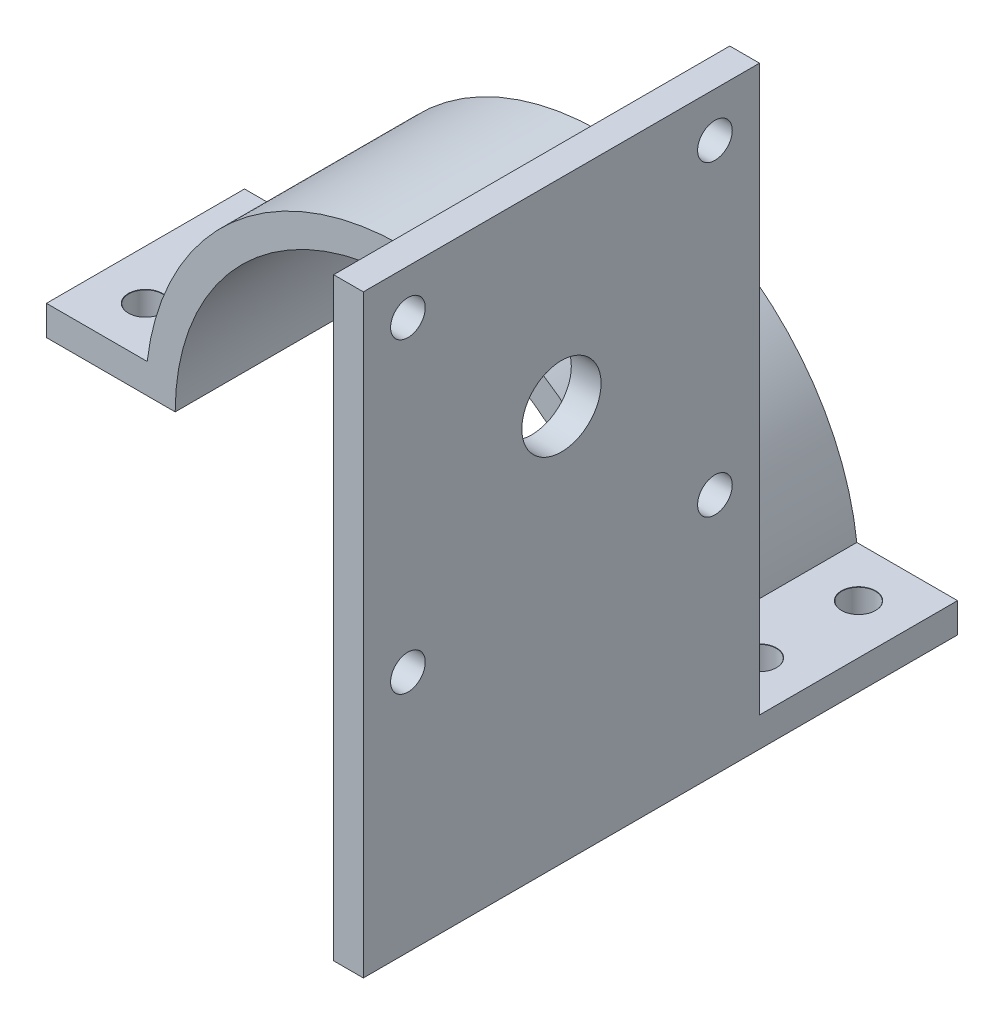
ISO-10303-21;
HEADER;
FILE_DESCRIPTION(('STEP AP214'),'2;1');
FILE_NAME('part.step','',(''),(''),'','','');
FILE_SCHEMA(('AUTOMOTIVE_DESIGN { 1 0 10303 214 1 1 1 1 }'));
ENDSEC;
DATA;
#1=APPLICATION_CONTEXT('core data for automotive mechanical design processes');
#2=APPLICATION_PROTOCOL_DEFINITION('international standard','automotive_design',2000,#1);
#3=PRODUCT_CONTEXT('',#1,'mechanical');
#4=PRODUCT('Part','Part','',(#3));
#5=PRODUCT_RELATED_PRODUCT_CATEGORY('part','',(#4));
#6=PRODUCT_DEFINITION_FORMATION('','',#4);
#7=PRODUCT_DEFINITION_CONTEXT('part definition',#1,'design');
#8=PRODUCT_DEFINITION('design','',#6,#7);
#9=PRODUCT_DEFINITION_SHAPE('','',#8);
#10=(LENGTH_UNIT() NAMED_UNIT(*) SI_UNIT(.MILLI.,.METRE.));
#11=(NAMED_UNIT(*) PLANE_ANGLE_UNIT() SI_UNIT($,.RADIAN.));
#12=(NAMED_UNIT(*) SI_UNIT($,.STERADIAN.) SOLID_ANGLE_UNIT());
#13=UNCERTAINTY_MEASURE_WITH_UNIT(LENGTH_MEASURE(1.E-05),#10,'distance_accuracy_value','');
#14=(GEOMETRIC_REPRESENTATION_CONTEXT(3) GLOBAL_UNCERTAINTY_ASSIGNED_CONTEXT((#13)) GLOBAL_UNIT_ASSIGNED_CONTEXT((#10,
#11,#12)) REPRESENTATION_CONTEXT('',''));
#15=CARTESIAN_POINT('',(0.,0.,0.));
#16=DIRECTION('',(0.,0.,1.));
#17=DIRECTION('',(1.,0.,0.));
#18=AXIS2_PLACEMENT_3D('',#15,#16,#17);
#19=CARTESIAN_POINT('',(0.,0.,20.));
#20=DIRECTION('',(0.,0.,-1.));
#21=DIRECTION('',(-1.,0.,0.));
#22=AXIS2_PLACEMENT_3D('',#19,#20,#21);
#23=PLANE('',#22);
#24=DIRECTION('',(0.,-1.,0.));
#25=VECTOR('',#24,1.);
#26=CARTESIAN_POINT('',(33.,60.,20.));
#27=LINE('',#26,#25);
#28=CARTESIAN_POINT('',(33.,2.99999999999999,20.));
#29=VERTEX_POINT('',#28);
#30=CARTESIAN_POINT('',(33.,0.,20.));
#31=VERTEX_POINT('',#30);
#32=EDGE_CURVE('E11',#29,#31,#27,.T.);
#33=ORIENTED_EDGE('',*,*,#32,.F.);
#34=DIRECTION('',(-1.,0.,0.));
#35=VECTOR('',#34,1.);
#36=CARTESIAN_POINT('',(23.,3.,20.));
#37=LINE('',#36,#35);
#38=CARTESIAN_POINT('',(25.8263431402899,3.,20.));
#39=VERTEX_POINT('',#38);
#40=EDGE_CURVE('E203',#29,#39,#37,.T.);
#41=ORIENTED_EDGE('',*,*,#40,.T.);
#42=CARTESIAN_POINT('',(0.,0.,20.));
#43=DIRECTION('',(0.,0.,1.));
#44=DIRECTION('',(-1.,0.,0.));
#45=AXIS2_PLACEMENT_3D('',#42,#43,#44);
#46=CIRCLE('',#45,26.);
#47=CARTESIAN_POINT('',(-25.8263431402899,3.,20.));
#48=VERTEX_POINT('',#47);
#49=EDGE_CURVE('E241',#39,#48,#46,.T.);
#50=ORIENTED_EDGE('',*,*,#49,.T.);
#51=DIRECTION('',(-1.,0.,0.));
#52=VECTOR('',#51,1.);
#53=CARTESIAN_POINT('',(-23.,3.,20.));
#54=LINE('',#53,#52);
#55=CARTESIAN_POINT('',(-36.,3.,20.));
#56=VERTEX_POINT('',#55);
#57=EDGE_CURVE('E215',#48,#56,#54,.T.);
#58=ORIENTED_EDGE('',*,*,#57,.T.);
#59=DIRECTION('',(0.,-1.,0.));
#60=VECTOR('',#59,1.);
#61=CARTESIAN_POINT('',(-36.,3.,20.));
#62=LINE('',#61,#60);
#63=CARTESIAN_POINT('',(-36.,0.,20.));
#64=VERTEX_POINT('',#63);
#65=EDGE_CURVE('E216',#56,#64,#62,.T.);
#66=ORIENTED_EDGE('',*,*,#65,.T.);
#67=DIRECTION('',(1.,0.,0.));
#68=VECTOR('',#67,1.);
#69=CARTESIAN_POINT('',(-23.,0.,20.));
#70=LINE('',#69,#68);
#71=CARTESIAN_POINT('',(-23.,0.,20.));
#72=VERTEX_POINT('',#71);
#73=EDGE_CURVE('E243',#64,#72,#70,.T.);
#74=ORIENTED_EDGE('',*,*,#73,.T.);
#75=CARTESIAN_POINT('',(0.,0.,20.));
#76=DIRECTION('',(0.,0.,-1.));
#77=DIRECTION('',(-1.,0.,0.));
#78=AXIS2_PLACEMENT_3D('',#75,#76,#77);
#79=CIRCLE('',#78,23.);
#80=CARTESIAN_POINT('',(23.,0.,20.));
#81=VERTEX_POINT('',#80);
#82=EDGE_CURVE('E235',#72,#81,#79,.T.);
#83=ORIENTED_EDGE('',*,*,#82,.T.);
#84=DIRECTION('',(1.,0.,0.));
#85=VECTOR('',#84,1.);
#86=CARTESIAN_POINT('',(23.,0.,20.));
#87=LINE('',#86,#85);
#88=EDGE_CURVE('E238',#81,#31,#87,.T.);
#89=ORIENTED_EDGE('',*,*,#88,.T.);
#90=EDGE_LOOP('',(#33,#41,#50,#58,#66,#74,#83,#89));
#91=FACE_BOUND('',#90,.T.);
#92=ADVANCED_FACE('F37',(#91),#23,.F.);
#93=CARTESIAN_POINT('',(0.,0.,20.));
#94=DIRECTION('',(0.,0.,-1.));
#95=DIRECTION('',(-1.,0.,0.));
#96=AXIS2_PLACEMENT_3D('',#93,#94,#95);
#97=CYLINDRICAL_SURFACE('',#96,23.);
#98=CARTESIAN_POINT('',(0.,0.,0.));
#99=DIRECTION('',(0.,0.,-1.));
#100=DIRECTION('',(-1.,0.,0.));
#101=AXIS2_PLACEMENT_3D('',#98,#99,#100);
#102=CIRCLE('',#101,23.);
#103=CARTESIAN_POINT('',(-23.,0.,0.));
#104=VERTEX_POINT('',#103);
#105=CARTESIAN_POINT('',(23.,0.,0.));
#106=VERTEX_POINT('',#105);
#107=EDGE_CURVE('E234',#104,#106,#102,.T.);
#108=ORIENTED_EDGE('',*,*,#107,.T.);
#109=DIRECTION('',(0.,0.,-1.));
#110=VECTOR('',#109,1.);
#111=CARTESIAN_POINT('',(23.,0.,20.));
#112=LINE('',#111,#110);
#113=EDGE_CURVE('E41',#81,#106,#112,.T.);
#114=ORIENTED_EDGE('',*,*,#113,.F.);
#115=ORIENTED_EDGE('',*,*,#82,.F.);
#116=DIRECTION('',(0.,0.,-1.));
#117=VECTOR('',#116,1.);
#118=CARTESIAN_POINT('',(-23.,0.,20.));
#119=LINE('',#118,#117);
#120=EDGE_CURVE('E245',#72,#104,#119,.T.);
#121=ORIENTED_EDGE('',*,*,#120,.T.);
#122=EDGE_LOOP('',(#108,#114,#115,#121));
#123=FACE_BOUND('',#122,.T.);
#124=ADVANCED_FACE('F39',(#123),#97,.F.);
#125=CARTESIAN_POINT('',(23.,0.,20.));
#126=DIRECTION('',(0.,1.,0.));
#127=DIRECTION('',(-1.,0.,0.));
#128=AXIS2_PLACEMENT_3D('',#125,#126,#127);
#129=PLANE('',#128);
#130=CARTESIAN_POINT('',(31.,0.,5.));
#131=DIRECTION('',(0.,1.,0.));
#132=DIRECTION('',(0.,0.,1.));
#133=AXIS2_PLACEMENT_3D('',#130,#131,#132);
#134=CIRCLE('',#133,1.7);
#135=CARTESIAN_POINT('',(31.,0.,6.7));
#136=VERTEX_POINT('',#135);
#137=EDGE_CURVE('E189',#136,#136,#134,.T.);
#138=ORIENTED_EDGE('',*,*,#137,.T.);
#139=EDGE_LOOP('',(#138));
#140=FACE_BOUND('',#139,.T.);
#141=CARTESIAN_POINT('',(31.,0.,15.));
#142=DIRECTION('',(0.,1.,0.));
#143=DIRECTION('',(0.,0.,1.));
#144=AXIS2_PLACEMENT_3D('',#141,#142,#143);
#145=CIRCLE('',#144,1.7);
#146=CARTESIAN_POINT('',(31.,0.,16.7));
#147=VERTEX_POINT('',#146);
#148=EDGE_CURVE('E198',#147,#147,#145,.T.);
#149=ORIENTED_EDGE('',*,*,#148,.T.);
#150=EDGE_LOOP('',(#149));
#151=FACE_BOUND('',#150,.T.);
#152=DIRECTION('',(1.,0.,0.));
#153=VECTOR('',#152,1.);
#154=CARTESIAN_POINT('',(23.,0.,0.));
#155=LINE('',#154,#153);
#156=CARTESIAN_POINT('',(36.,0.,0.));
#157=VERTEX_POINT('',#156);
#158=EDGE_CURVE('E248',#106,#157,#155,.T.);
#159=ORIENTED_EDGE('',*,*,#158,.T.);
#160=DIRECTION('',(0.,0.,1.));
#161=VECTOR('',#160,1.);
#162=CARTESIAN_POINT('',(36.,0.,-13.3416640641263));
#163=LINE('',#162,#161);
#164=CARTESIAN_POINT('',(36.,0.,60.));
#165=VERTEX_POINT('',#164);
#166=EDGE_CURVE('E201',#157,#165,#163,.T.);
#167=ORIENTED_EDGE('',*,*,#166,.T.);
#168=DIRECTION('',(-1.,0.,0.));
#169=VECTOR('',#168,1.);
#170=CARTESIAN_POINT('',(36.,0.,60.));
#171=LINE('',#170,#169);
#172=CARTESIAN_POINT('',(33.,0.,60.));
#173=VERTEX_POINT('',#172);
#174=EDGE_CURVE('E130',#165,#173,#171,.T.);
#175=ORIENTED_EDGE('',*,*,#174,.T.);
#176=DIRECTION('',(0.,0.,-1.));
#177=VECTOR('',#176,1.);
#178=CARTESIAN_POINT('',(33.,0.,20.));
#179=LINE('',#178,#177);
#180=EDGE_CURVE('E150',#173,#31,#179,.T.);
#181=ORIENTED_EDGE('',*,*,#180,.T.);
#182=ORIENTED_EDGE('',*,*,#88,.F.);
#183=ORIENTED_EDGE('',*,*,#113,.T.);
#184=EDGE_LOOP('',(#159,#167,#175,#181,#182,#183));
#185=FACE_BOUND('',#184,.T.);
#186=ADVANCED_FACE('F260',(#140,#151,#185),#129,.F.);
#187=CARTESIAN_POINT('',(0.,0.,20.));
#188=DIRECTION('',(0.,0.,-1.));
#189=DIRECTION('',(-1.,0.,0.));
#190=AXIS2_PLACEMENT_3D('',#187,#188,#189);
#191=CYLINDRICAL_SURFACE('',#190,26.);
#192=ORIENTED_EDGE('',*,*,#49,.F.);
#193=DIRECTION('',(0.,0.,-1.));
#194=VECTOR('',#193,1.);
#195=CARTESIAN_POINT('',(25.8263431402899,3.,20.));
#196=LINE('',#195,#194);
#197=CARTESIAN_POINT('',(25.8263431402899,3.,0.));
#198=VERTEX_POINT('',#197);
#199=EDGE_CURVE('E213',#39,#198,#196,.T.);
#200=ORIENTED_EDGE('',*,*,#199,.T.);
#201=CARTESIAN_POINT('',(0.,0.,0.));
#202=DIRECTION('',(0.,0.,1.));
#203=DIRECTION('',(-1.,0.,0.));
#204=AXIS2_PLACEMENT_3D('',#201,#202,#203);
#205=CIRCLE('',#204,26.);
#206=CARTESIAN_POINT('',(-25.8263431402899,3.,0.));
#207=VERTEX_POINT('',#206);
#208=EDGE_CURVE('E250',#198,#207,#205,.T.);
#209=ORIENTED_EDGE('',*,*,#208,.T.);
#210=DIRECTION('',(0.,0.,-1.));
#211=VECTOR('',#210,1.);
#212=CARTESIAN_POINT('',(-25.8263431402899,3.,20.));
#213=LINE('',#212,#211);
#214=EDGE_CURVE('E229',#207,#48,#213,.F.);
#215=ORIENTED_EDGE('',*,*,#214,.T.);
#216=EDGE_LOOP('',(#192,#200,#209,#215));
#217=FACE_BOUND('',#216,.T.);
#218=ADVANCED_FACE('F283',(#217),#191,.T.);
#219=CARTESIAN_POINT('',(-23.,0.,20.));
#220=DIRECTION('',(0.,1.,0.));
#221=DIRECTION('',(-1.,0.,0.));
#222=AXIS2_PLACEMENT_3D('',#219,#220,#221);
#223=PLANE('',#222);
#224=CARTESIAN_POINT('',(-31.,0.,5.));
#225=DIRECTION('',(0.,1.,0.));
#226=DIRECTION('',(0.,0.,1.));
#227=AXIS2_PLACEMENT_3D('',#224,#225,#226);
#228=CIRCLE('',#227,1.7);
#229=CARTESIAN_POINT('',(-31.,0.,6.7));
#230=VERTEX_POINT('',#229);
#231=EDGE_CURVE('E171',#230,#230,#228,.T.);
#232=ORIENTED_EDGE('',*,*,#231,.T.);
#233=EDGE_LOOP('',(#232));
#234=FACE_BOUND('',#233,.T.);
#235=CARTESIAN_POINT('',(-31.,0.,15.));
#236=DIRECTION('',(0.,1.,0.));
#237=DIRECTION('',(0.,0.,1.));
#238=AXIS2_PLACEMENT_3D('',#235,#236,#237);
#239=CIRCLE('',#238,1.7);
#240=CARTESIAN_POINT('',(-31.,0.,16.7));
#241=VERTEX_POINT('',#240);
#242=EDGE_CURVE('E180',#241,#241,#239,.T.);
#243=ORIENTED_EDGE('',*,*,#242,.T.);
#244=EDGE_LOOP('',(#243));
#245=FACE_BOUND('',#244,.T.);
#246=DIRECTION('',(1.,0.,0.));
#247=VECTOR('',#246,1.);
#248=CARTESIAN_POINT('',(-23.,0.,0.));
#249=LINE('',#248,#247);
#250=CARTESIAN_POINT('',(-36.,0.,0.));
#251=VERTEX_POINT('',#250);
#252=EDGE_CURVE('E239',#251,#104,#249,.T.);
#253=ORIENTED_EDGE('',*,*,#252,.T.);
#254=ORIENTED_EDGE('',*,*,#120,.F.);
#255=ORIENTED_EDGE('',*,*,#73,.F.);
#256=DIRECTION('',(0.,0.,1.));
#257=VECTOR('',#256,1.);
#258=CARTESIAN_POINT('',(-36.,0.,-13.3416640641263));
#259=LINE('',#258,#257);
#260=EDGE_CURVE('E224',#251,#64,#259,.T.);
#261=ORIENTED_EDGE('',*,*,#260,.F.);
#262=EDGE_LOOP('',(#253,#254,#255,#261));
#263=FACE_BOUND('',#262,.T.);
#264=ADVANCED_FACE('F287',(#234,#245,#263),#223,.F.);
#265=CARTESIAN_POINT('',(0.,0.,0.));
#266=DIRECTION('',(0.,0.,-1.));
#267=DIRECTION('',(-1.,0.,0.));
#268=AXIS2_PLACEMENT_3D('',#265,#266,#267);
#269=PLANE('',#268);
#270=ORIENTED_EDGE('',*,*,#158,.F.);
#271=ORIENTED_EDGE('',*,*,#107,.F.);
#272=ORIENTED_EDGE('',*,*,#252,.F.);
#273=DIRECTION('',(0.,-1.,0.));
#274=VECTOR('',#273,1.);
#275=CARTESIAN_POINT('',(-36.,3.,0.));
#276=LINE('',#275,#274);
#277=CARTESIAN_POINT('',(-36.,3.,0.));
#278=VERTEX_POINT('',#277);
#279=EDGE_CURVE('E221',#278,#251,#276,.T.);
#280=ORIENTED_EDGE('',*,*,#279,.F.);
#281=DIRECTION('',(-1.,0.,0.));
#282=VECTOR('',#281,1.);
#283=CARTESIAN_POINT('',(-23.,3.,0.));
#284=LINE('',#283,#282);
#285=EDGE_CURVE('E219',#207,#278,#284,.T.);
#286=ORIENTED_EDGE('',*,*,#285,.F.);
#287=ORIENTED_EDGE('',*,*,#208,.F.);
#288=DIRECTION('',(-1.,0.,0.));
#289=VECTOR('',#288,1.);
#290=CARTESIAN_POINT('',(23.,3.,0.));
#291=LINE('',#290,#289);
#292=CARTESIAN_POINT('',(36.,2.99999999999999,0.));
#293=VERTEX_POINT('',#292);
#294=EDGE_CURVE('E60',#293,#198,#291,.T.);
#295=ORIENTED_EDGE('',*,*,#294,.F.);
#296=DIRECTION('',(0.,1.,0.));
#297=VECTOR('',#296,1.);
#298=CARTESIAN_POINT('',(36.,2.99999999999999,0.));
#299=LINE('',#298,#297);
#300=EDGE_CURVE('E204',#157,#293,#299,.T.);
#301=ORIENTED_EDGE('',*,*,#300,.F.);
#302=EDGE_LOOP('',(#270,#271,#272,#280,#286,#287,#295,#301));
#303=FACE_BOUND('',#302,.T.);
#304=ADVANCED_FACE('F263',(#303),#269,.T.);
#305=CARTESIAN_POINT('',(-23.,3.,-13.3416640641263));
#306=DIRECTION('',(0.,1.,0.));
#307=DIRECTION('',(-1.,0.,0.));
#308=AXIS2_PLACEMENT_3D('',#305,#306,#307);
#309=PLANE('',#308);
#310=CARTESIAN_POINT('',(-31.,3.,5.));
#311=DIRECTION('',(0.,1.,0.));
#312=DIRECTION('',(0.,0.,1.));
#313=AXIS2_PLACEMENT_3D('',#310,#311,#312);
#314=CIRCLE('',#313,1.725);
#315=CARTESIAN_POINT('',(-31.,3.,6.725));
#316=VERTEX_POINT('',#315);
#317=EDGE_CURVE('E162',#316,#316,#314,.T.);
#318=ORIENTED_EDGE('',*,*,#317,.F.);
#319=EDGE_LOOP('',(#318));
#320=FACE_BOUND('',#319,.T.);
#321=CARTESIAN_POINT('',(-31.,3.,15.));
#322=DIRECTION('',(0.,1.,0.));
#323=DIRECTION('',(0.,0.,1.));
#324=AXIS2_PLACEMENT_3D('',#321,#322,#323);
#325=CIRCLE('',#324,1.725);
#326=CARTESIAN_POINT('',(-31.,3.,16.725));
#327=VERTEX_POINT('',#326);
#328=EDGE_CURVE('E174',#327,#327,#325,.T.);
#329=ORIENTED_EDGE('',*,*,#328,.F.);
#330=EDGE_LOOP('',(#329));
#331=FACE_BOUND('',#330,.T.);
#332=ORIENTED_EDGE('',*,*,#214,.F.);
#333=ORIENTED_EDGE('',*,*,#285,.T.);
#334=DIRECTION('',(0.,0.,1.));
#335=VECTOR('',#334,1.);
#336=CARTESIAN_POINT('',(-36.,3.,-13.3416640641263));
#337=LINE('',#336,#335);
#338=EDGE_CURVE('E225',#278,#56,#337,.T.);
#339=ORIENTED_EDGE('',*,*,#338,.T.);
#340=ORIENTED_EDGE('',*,*,#57,.F.);
#341=EDGE_LOOP('',(#332,#333,#339,#340));
#342=FACE_BOUND('',#341,.T.);
#343=ADVANCED_FACE('F279',(#320,#331,#342),#309,.T.);
#344=CARTESIAN_POINT('',(-36.,3.,-13.3416640641263));
#345=DIRECTION('',(-1.,0.,0.));
#346=DIRECTION('',(0.,0.,1.));
#347=AXIS2_PLACEMENT_3D('',#344,#345,#346);
#348=PLANE('',#347);
#349=ORIENTED_EDGE('',*,*,#338,.F.);
#350=ORIENTED_EDGE('',*,*,#279,.T.);
#351=ORIENTED_EDGE('',*,*,#260,.T.);
#352=ORIENTED_EDGE('',*,*,#65,.F.);
#353=EDGE_LOOP('',(#349,#350,#351,#352));
#354=FACE_BOUND('',#353,.T.);
#355=ADVANCED_FACE('F285',(#354),#348,.T.);
#356=CARTESIAN_POINT('',(23.,3.,-13.3416640641263));
#357=DIRECTION('',(0.,1.,0.));
#358=DIRECTION('',(-1.,0.,0.));
#359=AXIS2_PLACEMENT_3D('',#356,#357,#358);
#360=PLANE('',#359);
#361=CARTESIAN_POINT('',(31.,3.00000000000001,5.));
#362=DIRECTION('',(0.,1.,0.));
#363=DIRECTION('',(0.,0.,1.));
#364=AXIS2_PLACEMENT_3D('',#361,#362,#363);
#365=CIRCLE('',#364,1.725);
#366=CARTESIAN_POINT('',(31.,3.00000000000001,6.725));
#367=VERTEX_POINT('',#366);
#368=EDGE_CURVE('E183',#367,#367,#365,.T.);
#369=ORIENTED_EDGE('',*,*,#368,.F.);
#370=EDGE_LOOP('',(#369));
#371=FACE_BOUND('',#370,.T.);
#372=CARTESIAN_POINT('',(31.,3.00000000000001,15.));
#373=DIRECTION('',(0.,1.,0.));
#374=DIRECTION('',(0.,0.,1.));
#375=AXIS2_PLACEMENT_3D('',#372,#373,#374);
#376=CIRCLE('',#375,1.725);
#377=CARTESIAN_POINT('',(31.,3.00000000000001,16.725));
#378=VERTEX_POINT('',#377);
#379=EDGE_CURVE('E192',#378,#378,#376,.T.);
#380=ORIENTED_EDGE('',*,*,#379,.F.);
#381=EDGE_LOOP('',(#380));
#382=FACE_BOUND('',#381,.T.);
#383=ORIENTED_EDGE('',*,*,#199,.F.);
#384=ORIENTED_EDGE('',*,*,#40,.F.);
#385=CARTESIAN_POINT('',(36.,2.99999999999999,20.));
#386=VERTEX_POINT('',#385);
#387=EDGE_CURVE('E210',#386,#29,#37,.T.);
#388=ORIENTED_EDGE('',*,*,#387,.F.);
#389=DIRECTION('',(0.,0.,1.));
#390=VECTOR('',#389,1.);
#391=CARTESIAN_POINT('',(36.,2.99999999999999,-13.3416640641263));
#392=LINE('',#391,#390);
#393=EDGE_CURVE('E205',#293,#386,#392,.T.);
#394=ORIENTED_EDGE('',*,*,#393,.F.);
#395=ORIENTED_EDGE('',*,*,#294,.T.);
#396=EDGE_LOOP('',(#383,#384,#388,#394,#395));
#397=FACE_BOUND('',#396,.T.);
#398=ADVANCED_FACE('F273',(#371,#382,#397),#360,.T.);
#399=CARTESIAN_POINT('',(36.,2.99999999999999,-13.3416640641263));
#400=DIRECTION('',(1.,0.,0.));
#401=DIRECTION('',(0.,0.,-1.));
#402=AXIS2_PLACEMENT_3D('',#399,#400,#401);
#403=PLANE('',#402);
#404=CARTESIAN_POINT('',(36.,55.5,55.5));
#405=DIRECTION('',(1.,0.,0.));
#406=DIRECTION('',(0.,0.,-1.));
#407=AXIS2_PLACEMENT_3D('',#404,#405,#406);
#408=CIRCLE('',#407,1.75);
#409=CARTESIAN_POINT('',(36.,55.5,53.75));
#410=VERTEX_POINT('',#409);
#411=EDGE_CURVE('E403',#410,#410,#408,.T.);
#412=ORIENTED_EDGE('',*,*,#411,.F.);
#413=EDGE_LOOP('',(#412));
#414=FACE_BOUND('',#413,.T.);
#415=CARTESIAN_POINT('',(36.,24.5,55.5));
#416=DIRECTION('',(1.,0.,0.));
#417=DIRECTION('',(0.,0.,-1.));
#418=AXIS2_PLACEMENT_3D('',#415,#416,#417);
#419=CIRCLE('',#418,1.75);
#420=CARTESIAN_POINT('',(36.,24.5,53.75));
#421=VERTEX_POINT('',#420);
#422=EDGE_CURVE('E397',#421,#421,#419,.T.);
#423=ORIENTED_EDGE('',*,*,#422,.F.);
#424=EDGE_LOOP('',(#423));
#425=FACE_BOUND('',#424,.T.);
#426=CARTESIAN_POINT('',(36.,55.5,24.5));
#427=DIRECTION('',(1.,0.,0.));
#428=DIRECTION('',(0.,0.,-1.));
#429=AXIS2_PLACEMENT_3D('',#426,#427,#428);
#430=CIRCLE('',#429,1.75);
#431=CARTESIAN_POINT('',(36.,55.5,22.75));
#432=VERTEX_POINT('',#431);
#433=EDGE_CURVE('E389',#432,#432,#430,.T.);
#434=ORIENTED_EDGE('',*,*,#433,.F.);
#435=EDGE_LOOP('',(#434));
#436=FACE_BOUND('',#435,.T.);
#437=CARTESIAN_POINT('',(36.,24.5,24.5));
#438=DIRECTION('',(1.,0.,0.));
#439=DIRECTION('',(0.,0.,-1.));
#440=AXIS2_PLACEMENT_3D('',#437,#438,#439);
#441=CIRCLE('',#440,1.75);
#442=CARTESIAN_POINT('',(36.,24.5,22.75));
#443=VERTEX_POINT('',#442);
#444=EDGE_CURVE('E383',#443,#443,#441,.T.);
#445=ORIENTED_EDGE('',*,*,#444,.F.);
#446=EDGE_LOOP('',(#445));
#447=FACE_BOUND('',#446,.T.);
#448=CARTESIAN_POINT('',(36.,40.,40.));
#449=DIRECTION('',(1.,0.,0.));
#450=DIRECTION('',(0.,0.,-1.));
#451=AXIS2_PLACEMENT_3D('',#448,#449,#450);
#452=CIRCLE('',#451,4.00000000000001);
#453=CARTESIAN_POINT('',(36.,40.,36.));
#454=VERTEX_POINT('',#453);
#455=EDGE_CURVE('E160',#454,#454,#452,.T.);
#456=ORIENTED_EDGE('',*,*,#455,.F.);
#457=EDGE_LOOP('',(#456));
#458=FACE_BOUND('',#457,.T.);
#459=ORIENTED_EDGE('',*,*,#166,.F.);
#460=ORIENTED_EDGE('',*,*,#300,.T.);
#461=ORIENTED_EDGE('',*,*,#393,.T.);
#462=DIRECTION('',(0.,-1.,0.));
#463=VECTOR('',#462,1.);
#464=CARTESIAN_POINT('',(36.,60.,20.));
#465=LINE('',#464,#463);
#466=CARTESIAN_POINT('',(36.,60.,20.));
#467=VERTEX_POINT('',#466);
#468=EDGE_CURVE('E149',#467,#386,#465,.T.);
#469=ORIENTED_EDGE('',*,*,#468,.F.);
#470=DIRECTION('',(0.,0.,1.));
#471=VECTOR('',#470,1.);
#472=CARTESIAN_POINT('',(36.,60.,20.));
#473=LINE('',#472,#471);
#474=CARTESIAN_POINT('',(36.,60.,60.));
#475=VERTEX_POINT('',#474);
#476=EDGE_CURVE('E142',#467,#475,#473,.T.);
#477=ORIENTED_EDGE('',*,*,#476,.T.);
#478=DIRECTION('',(0.,-1.,0.));
#479=VECTOR('',#478,1.);
#480=CARTESIAN_POINT('',(36.,60.,60.));
#481=LINE('',#480,#479);
#482=EDGE_CURVE('E125',#475,#165,#481,.T.);
#483=ORIENTED_EDGE('',*,*,#482,.T.);
#484=EDGE_LOOP('',(#459,#460,#461,#469,#477,#483));
#485=FACE_BOUND('',#484,.T.);
#486=ADVANCED_FACE('F147',(#414,#425,#436,#447,#458,#485),#403,.T.);
#487=CARTESIAN_POINT('',(31.,3.00000000000001,15.));
#488=DIRECTION('',(0.,1.,0.));
#489=DIRECTION('',(0.,0.,1.));
#490=AXIS2_PLACEMENT_3D('',#487,#488,#489);
#491=CYLINDRICAL_SURFACE('',#490,1.69999999999999);
#492=ORIENTED_EDGE('',*,*,#148,.F.);
#493=EDGE_LOOP('',(#492));
#494=FACE_BOUND('',#493,.T.);
#495=CARTESIAN_POINT('',(31.,2.97124078981949,15.));
#496=DIRECTION('',(0.,1.,0.));
#497=DIRECTION('',(0.,0.,1.));
#498=AXIS2_PLACEMENT_3D('',#495,#496,#497);
#499=CIRCLE('',#498,1.69999999999999);
#500=CARTESIAN_POINT('',(31.,2.97124078981949,16.7));
#501=VERTEX_POINT('',#500);
#502=EDGE_CURVE('E195',#501,#501,#499,.T.);
#503=ORIENTED_EDGE('',*,*,#502,.T.);
#504=EDGE_LOOP('',(#503));
#505=FACE_BOUND('',#504,.T.);
#506=ADVANCED_FACE('F314',(#494,#505),#491,.F.);
#507=CARTESIAN_POINT('',(31.,3.00000000000001,15.));
#508=DIRECTION('',(0.,1.,0.));
#509=DIRECTION('',(0.,0.,1.));
#510=AXIS2_PLACEMENT_3D('',#507,#508,#509);
#511=CONICAL_SURFACE('',#510,1.725,0.71558499331804);
#512=ORIENTED_EDGE('',*,*,#502,.F.);
#513=EDGE_LOOP('',(#512));
#514=FACE_BOUND('',#513,.T.);
#515=ORIENTED_EDGE('',*,*,#379,.T.);
#516=EDGE_LOOP('',(#515));
#517=FACE_BOUND('',#516,.T.);
#518=ADVANCED_FACE('F318',(#514,#517),#511,.F.);
#519=CARTESIAN_POINT('',(31.,3.00000000000001,5.));
#520=DIRECTION('',(0.,1.,0.));
#521=DIRECTION('',(0.,0.,1.));
#522=AXIS2_PLACEMENT_3D('',#519,#520,#521);
#523=CYLINDRICAL_SURFACE('',#522,1.69999999999999);
#524=ORIENTED_EDGE('',*,*,#137,.F.);
#525=EDGE_LOOP('',(#524));
#526=FACE_BOUND('',#525,.T.);
#527=CARTESIAN_POINT('',(31.,2.97124078981949,5.));
#528=DIRECTION('',(0.,1.,0.));
#529=DIRECTION('',(0.,0.,1.));
#530=AXIS2_PLACEMENT_3D('',#527,#528,#529);
#531=CIRCLE('',#530,1.69999999999999);
#532=CARTESIAN_POINT('',(31.,2.97124078981949,6.69999999999999));
#533=VERTEX_POINT('',#532);
#534=EDGE_CURVE('E186',#533,#533,#531,.T.);
#535=ORIENTED_EDGE('',*,*,#534,.T.);
#536=EDGE_LOOP('',(#535));
#537=FACE_BOUND('',#536,.T.);
#538=ADVANCED_FACE('F322',(#526,#537),#523,.F.);
#539=CARTESIAN_POINT('',(31.,3.00000000000001,5.));
#540=DIRECTION('',(0.,1.,0.));
#541=DIRECTION('',(0.,0.,1.));
#542=AXIS2_PLACEMENT_3D('',#539,#540,#541);
#543=CONICAL_SURFACE('',#542,1.725,0.71558499331804);
#544=ORIENTED_EDGE('',*,*,#534,.F.);
#545=EDGE_LOOP('',(#544));
#546=FACE_BOUND('',#545,.T.);
#547=ORIENTED_EDGE('',*,*,#368,.T.);
#548=EDGE_LOOP('',(#547));
#549=FACE_BOUND('',#548,.T.);
#550=ADVANCED_FACE('F326',(#546,#549),#543,.F.);
#551=CARTESIAN_POINT('',(-31.,3.,15.));
#552=DIRECTION('',(0.,1.,0.));
#553=DIRECTION('',(0.,0.,1.));
#554=AXIS2_PLACEMENT_3D('',#551,#552,#553);
#555=CYLINDRICAL_SURFACE('',#554,1.69999999999999);
#556=ORIENTED_EDGE('',*,*,#242,.F.);
#557=EDGE_LOOP('',(#556));
#558=FACE_BOUND('',#557,.T.);
#559=CARTESIAN_POINT('',(-31.,2.97124078981949,15.));
#560=DIRECTION('',(0.,1.,0.));
#561=DIRECTION('',(0.,0.,1.));
#562=AXIS2_PLACEMENT_3D('',#559,#560,#561);
#563=CIRCLE('',#562,1.69999999999999);
#564=CARTESIAN_POINT('',(-31.,2.97124078981949,16.7));
#565=VERTEX_POINT('',#564);
#566=EDGE_CURVE('E177',#565,#565,#563,.T.);
#567=ORIENTED_EDGE('',*,*,#566,.T.);
#568=EDGE_LOOP('',(#567));
#569=FACE_BOUND('',#568,.T.);
#570=ADVANCED_FACE('F330',(#558,#569),#555,.F.);
#571=CARTESIAN_POINT('',(-31.,3.,15.));
#572=DIRECTION('',(0.,1.,0.));
#573=DIRECTION('',(0.,0.,1.));
#574=AXIS2_PLACEMENT_3D('',#571,#572,#573);
#575=CONICAL_SURFACE('',#574,1.725,0.71558499331804);
#576=ORIENTED_EDGE('',*,*,#566,.F.);
#577=EDGE_LOOP('',(#576));
#578=FACE_BOUND('',#577,.T.);
#579=ORIENTED_EDGE('',*,*,#328,.T.);
#580=EDGE_LOOP('',(#579));
#581=FACE_BOUND('',#580,.T.);
#582=ADVANCED_FACE('F334',(#578,#581),#575,.F.);
#583=CARTESIAN_POINT('',(-31.,3.,5.));
#584=DIRECTION('',(0.,1.,0.));
#585=DIRECTION('',(0.,0.,1.));
#586=AXIS2_PLACEMENT_3D('',#583,#584,#585);
#587=CYLINDRICAL_SURFACE('',#586,1.69999999999999);
#588=ORIENTED_EDGE('',*,*,#231,.F.);
#589=EDGE_LOOP('',(#588));
#590=FACE_BOUND('',#589,.T.);
#591=CARTESIAN_POINT('',(-31.,2.97124078981949,5.));
#592=DIRECTION('',(0.,1.,0.));
#593=DIRECTION('',(0.,0.,1.));
#594=AXIS2_PLACEMENT_3D('',#591,#592,#593);
#595=CIRCLE('',#594,1.69999999999999);
#596=CARTESIAN_POINT('',(-31.,2.97124078981949,6.69999999999999));
#597=VERTEX_POINT('',#596);
#598=EDGE_CURVE('E168',#597,#597,#595,.T.);
#599=ORIENTED_EDGE('',*,*,#598,.T.);
#600=EDGE_LOOP('',(#599));
#601=FACE_BOUND('',#600,.T.);
#602=ADVANCED_FACE('F338',(#590,#601),#587,.F.);
#603=CARTESIAN_POINT('',(-31.,3.,5.));
#604=DIRECTION('',(0.,1.,0.));
#605=DIRECTION('',(0.,0.,1.));
#606=AXIS2_PLACEMENT_3D('',#603,#604,#605);
#607=CONICAL_SURFACE('',#606,1.725,0.71558499331804);
#608=ORIENTED_EDGE('',*,*,#598,.F.);
#609=EDGE_LOOP('',(#608));
#610=FACE_BOUND('',#609,.T.);
#611=ORIENTED_EDGE('',*,*,#317,.T.);
#612=EDGE_LOOP('',(#611));
#613=FACE_BOUND('',#612,.T.);
#614=ADVANCED_FACE('F342',(#610,#613),#607,.F.);
#615=CARTESIAN_POINT('',(36.,60.,20.));
#616=DIRECTION('',(0.,0.,-1.));
#617=DIRECTION('',(-1.,0.,0.));
#618=AXIS2_PLACEMENT_3D('',#615,#616,#617);
#619=PLANE('',#618);
#620=ORIENTED_EDGE('',*,*,#468,.T.);
#621=ORIENTED_EDGE('',*,*,#387,.T.);
#622=CARTESIAN_POINT('',(33.,60.,20.));
#623=VERTEX_POINT('',#622);
#624=EDGE_CURVE('E47',#623,#29,#27,.T.);
#625=ORIENTED_EDGE('',*,*,#624,.F.);
#626=DIRECTION('',(1.,0.,0.));
#627=VECTOR('',#626,1.);
#628=CARTESIAN_POINT('',(36.,60.,20.));
#629=LINE('',#628,#627);
#630=EDGE_CURVE('E135',#623,#467,#629,.T.);
#631=ORIENTED_EDGE('',*,*,#630,.T.);
#632=EDGE_LOOP('',(#620,#621,#625,#631));
#633=FACE_BOUND('',#632,.T.);
#634=ADVANCED_FACE('F271',(#633),#619,.T.);
#635=CARTESIAN_POINT('',(33.,60.,20.));
#636=DIRECTION('',(-1.,0.,0.));
#637=DIRECTION('',(0.,-1.,0.));
#638=AXIS2_PLACEMENT_3D('',#635,#636,#637);
#639=PLANE('',#638);
#640=CARTESIAN_POINT('',(33.,55.5,55.5));
#641=DIRECTION('',(-1.,0.,0.));
#642=DIRECTION('',(0.,-1.,0.));
#643=AXIS2_PLACEMENT_3D('',#640,#641,#642);
#644=CIRCLE('',#643,1.75);
#645=CARTESIAN_POINT('',(33.,53.75,55.5));
#646=VERTEX_POINT('',#645);
#647=EDGE_CURVE('E400',#646,#646,#644,.F.);
#648=ORIENTED_EDGE('',*,*,#647,.T.);
#649=EDGE_LOOP('',(#648));
#650=FACE_BOUND('',#649,.T.);
#651=CARTESIAN_POINT('',(33.,24.5,55.5));
#652=DIRECTION('',(-1.,0.,0.));
#653=DIRECTION('',(0.,-1.,0.));
#654=AXIS2_PLACEMENT_3D('',#651,#652,#653);
#655=CIRCLE('',#654,1.75);
#656=CARTESIAN_POINT('',(33.,22.75,55.5));
#657=VERTEX_POINT('',#656);
#658=EDGE_CURVE('E394',#657,#657,#655,.F.);
#659=ORIENTED_EDGE('',*,*,#658,.T.);
#660=EDGE_LOOP('',(#659));
#661=FACE_BOUND('',#660,.T.);
#662=CARTESIAN_POINT('',(33.,55.5,24.5));
#663=DIRECTION('',(-1.,0.,0.));
#664=DIRECTION('',(0.,-1.,0.));
#665=AXIS2_PLACEMENT_3D('',#662,#663,#664);
#666=CIRCLE('',#665,1.75);
#667=CARTESIAN_POINT('',(33.,53.75,24.5));
#668=VERTEX_POINT('',#667);
#669=EDGE_CURVE('E385',#668,#668,#666,.F.);
#670=ORIENTED_EDGE('',*,*,#669,.T.);
#671=EDGE_LOOP('',(#670));
#672=FACE_BOUND('',#671,.T.);
#673=CARTESIAN_POINT('',(33.,24.5,24.5));
#674=DIRECTION('',(-1.,0.,0.));
#675=DIRECTION('',(0.,-1.,0.));
#676=AXIS2_PLACEMENT_3D('',#673,#674,#675);
#677=CIRCLE('',#676,1.75);
#678=CARTESIAN_POINT('',(33.,22.75,24.5));
#679=VERTEX_POINT('',#678);
#680=EDGE_CURVE('E380',#679,#679,#677,.F.);
#681=ORIENTED_EDGE('',*,*,#680,.T.);
#682=EDGE_LOOP('',(#681));
#683=FACE_BOUND('',#682,.T.);
#684=CARTESIAN_POINT('',(33.,40.,40.));
#685=DIRECTION('',(-1.,0.,0.));
#686=DIRECTION('',(0.,-1.,0.));
#687=AXIS2_PLACEMENT_3D('',#684,#685,#686);
#688=CIRCLE('',#687,4.00000000000001);
#689=CARTESIAN_POINT('',(33.,36.,40.));
#690=VERTEX_POINT('',#689);
#691=EDGE_CURVE('E155',#690,#690,#688,.F.);
#692=ORIENTED_EDGE('',*,*,#691,.T.);
#693=EDGE_LOOP('',(#692));
#694=FACE_BOUND('',#693,.T.);
#695=ORIENTED_EDGE('',*,*,#180,.F.);
#696=DIRECTION('',(0.,-1.,0.));
#697=VECTOR('',#696,1.);
#698=CARTESIAN_POINT('',(33.,60.,60.));
#699=LINE('',#698,#697);
#700=CARTESIAN_POINT('',(33.,60.,60.));
#701=VERTEX_POINT('',#700);
#702=EDGE_CURVE('E134',#701,#173,#699,.T.);
#703=ORIENTED_EDGE('',*,*,#702,.F.);
#704=DIRECTION('',(0.,0.,-1.));
#705=VECTOR('',#704,1.);
#706=CARTESIAN_POINT('',(33.,60.,20.));
#707=LINE('',#706,#705);
#708=EDGE_CURVE('E145',#701,#623,#707,.T.);
#709=ORIENTED_EDGE('',*,*,#708,.T.);
#710=ORIENTED_EDGE('',*,*,#624,.T.);
#711=ORIENTED_EDGE('',*,*,#32,.T.);
#712=EDGE_LOOP('',(#695,#703,#709,#710,#711));
#713=FACE_BOUND('',#712,.T.);
#714=ADVANCED_FACE('F269',(#650,#661,#672,#683,#694,#713),#639,.T.);
#715=CARTESIAN_POINT('',(36.,60.,60.));
#716=DIRECTION('',(0.,0.,1.));
#717=DIRECTION('',(1.,0.,0.));
#718=AXIS2_PLACEMENT_3D('',#715,#716,#717);
#719=PLANE('',#718);
#720=ORIENTED_EDGE('',*,*,#174,.F.);
#721=ORIENTED_EDGE('',*,*,#482,.F.);
#722=DIRECTION('',(-1.,0.,0.));
#723=VECTOR('',#722,1.);
#724=CARTESIAN_POINT('',(36.,60.,60.));
#725=LINE('',#724,#723);
#726=EDGE_CURVE('E128',#475,#701,#725,.T.);
#727=ORIENTED_EDGE('',*,*,#726,.T.);
#728=ORIENTED_EDGE('',*,*,#702,.T.);
#729=EDGE_LOOP('',(#720,#721,#727,#728));
#730=FACE_BOUND('',#729,.T.);
#731=ADVANCED_FACE('F127',(#730),#719,.T.);
#732=CARTESIAN_POINT('',(0.,60.,0.));
#733=DIRECTION('',(0.,-1.,0.));
#734=DIRECTION('',(1.,0.,0.));
#735=AXIS2_PLACEMENT_3D('',#732,#733,#734);
#736=PLANE('',#735);
#737=ORIENTED_EDGE('',*,*,#476,.F.);
#738=ORIENTED_EDGE('',*,*,#630,.F.);
#739=ORIENTED_EDGE('',*,*,#708,.F.);
#740=ORIENTED_EDGE('',*,*,#726,.F.);
#741=EDGE_LOOP('',(#737,#738,#739,#740));
#742=FACE_BOUND('',#741,.T.);
#743=ADVANCED_FACE('F140',(#742),#736,.F.);
#744=CARTESIAN_POINT('',(-36.001,40.,40.));
#745=DIRECTION('',(1.,0.,0.));
#746=DIRECTION('',(0.,0.,-1.));
#747=AXIS2_PLACEMENT_3D('',#744,#745,#746);
#748=CYLINDRICAL_SURFACE('',#747,4.00000000000001);
#749=ORIENTED_EDGE('',*,*,#691,.F.);
#750=EDGE_LOOP('',(#749));
#751=FACE_BOUND('',#750,.T.);
#752=ORIENTED_EDGE('',*,*,#455,.T.);
#753=EDGE_LOOP('',(#752));
#754=FACE_BOUND('',#753,.T.);
#755=ADVANCED_FACE('F356',(#751,#754),#748,.F.);
#756=CARTESIAN_POINT('',(-36.001,24.5,24.5));
#757=DIRECTION('',(1.,0.,0.));
#758=DIRECTION('',(0.,0.,-1.));
#759=AXIS2_PLACEMENT_3D('',#756,#757,#758);
#760=CYLINDRICAL_SURFACE('',#759,1.75);
#761=ORIENTED_EDGE('',*,*,#680,.F.);
#762=EDGE_LOOP('',(#761));
#763=FACE_BOUND('',#762,.T.);
#764=ORIENTED_EDGE('',*,*,#444,.T.);
#765=EDGE_LOOP('',(#764));
#766=FACE_BOUND('',#765,.T.);
#767=ADVANCED_FACE('F359',(#763,#766),#760,.F.);
#768=CARTESIAN_POINT('',(-36.001,55.5,24.5));
#769=DIRECTION('',(1.,0.,0.));
#770=DIRECTION('',(0.,0.,-1.));
#771=AXIS2_PLACEMENT_3D('',#768,#769,#770);
#772=CYLINDRICAL_SURFACE('',#771,1.75);
#773=ORIENTED_EDGE('',*,*,#669,.F.);
#774=EDGE_LOOP('',(#773));
#775=FACE_BOUND('',#774,.T.);
#776=ORIENTED_EDGE('',*,*,#433,.T.);
#777=EDGE_LOOP('',(#776));
#778=FACE_BOUND('',#777,.T.);
#779=ADVANCED_FACE('F368',(#775,#778),#772,.F.);
#780=CARTESIAN_POINT('',(-36.001,24.5,55.5));
#781=DIRECTION('',(1.,0.,0.));
#782=DIRECTION('',(0.,0.,-1.));
#783=AXIS2_PLACEMENT_3D('',#780,#781,#782);
#784=CYLINDRICAL_SURFACE('',#783,1.75);
#785=ORIENTED_EDGE('',*,*,#658,.F.);
#786=EDGE_LOOP('',(#785));
#787=FACE_BOUND('',#786,.T.);
#788=ORIENTED_EDGE('',*,*,#422,.T.);
#789=EDGE_LOOP('',(#788));
#790=FACE_BOUND('',#789,.T.);
#791=ADVANCED_FACE('F364',(#787,#790),#784,.F.);
#792=CARTESIAN_POINT('',(-36.001,55.5,55.5));
#793=DIRECTION('',(1.,0.,0.));
#794=DIRECTION('',(0.,0.,-1.));
#795=AXIS2_PLACEMENT_3D('',#792,#793,#794);
#796=CYLINDRICAL_SURFACE('',#795,1.75);
#797=ORIENTED_EDGE('',*,*,#647,.F.);
#798=EDGE_LOOP('',(#797));
#799=FACE_BOUND('',#798,.T.);
#800=ORIENTED_EDGE('',*,*,#411,.T.);
#801=EDGE_LOOP('',(#800));
#802=FACE_BOUND('',#801,.T.);
#803=ADVANCED_FACE('F361',(#799,#802),#796,.F.);
#804=CLOSED_SHELL('',(#92,#124,#186,#218,#264,#304,#343,#355,#398,#486,#506,#518,#538,#550,#570,
#582,#602,#614,#634,#714,#731,#743,#755,#767,#779,#791,#803));
#805=MANIFOLD_SOLID_BREP('B2',#804);
#806=ADVANCED_BREP_SHAPE_REPRESENTATION('',(#18,#805),#14);
#807=SHAPE_DEFINITION_REPRESENTATION(#9,#806);
ENDSEC;
END-ISO-10303-21;
